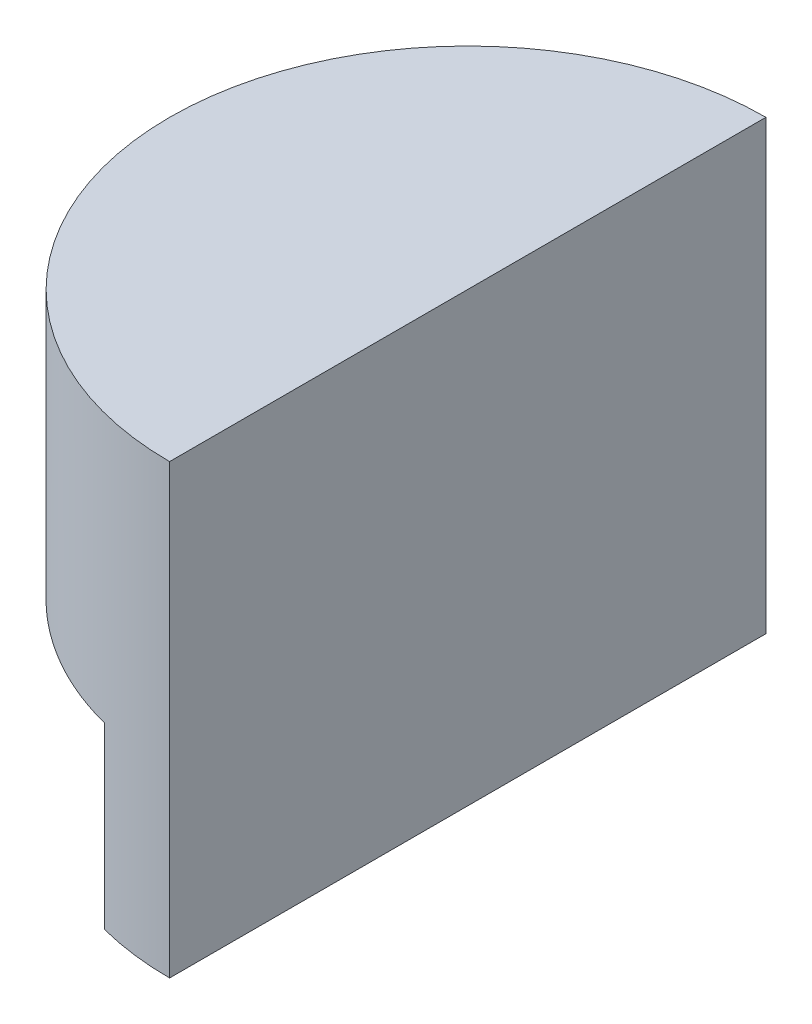
ISO-10303-21;
HEADER;
FILE_DESCRIPTION(('STEP AP214'),'2;1');
FILE_NAME('part.step','',(''),(''),'','','');
FILE_SCHEMA(('AUTOMOTIVE_DESIGN { 1 0 10303 214 1 1 1 1 }'));
ENDSEC;
DATA;
#1=APPLICATION_CONTEXT('core data for automotive mechanical design processes');
#2=APPLICATION_PROTOCOL_DEFINITION('international standard','automotive_design',2000,#1);
#3=PRODUCT_CONTEXT('',#1,'mechanical');
#4=PRODUCT('Part','Part','',(#3));
#5=PRODUCT_RELATED_PRODUCT_CATEGORY('part','',(#4));
#6=PRODUCT_DEFINITION_FORMATION('','',#4);
#7=PRODUCT_DEFINITION_CONTEXT('part definition',#1,'design');
#8=PRODUCT_DEFINITION('design','',#6,#7);
#9=PRODUCT_DEFINITION_SHAPE('','',#8);
#10=(LENGTH_UNIT() NAMED_UNIT(*) SI_UNIT(.MILLI.,.METRE.));
#11=(NAMED_UNIT(*) PLANE_ANGLE_UNIT() SI_UNIT($,.RADIAN.));
#12=(NAMED_UNIT(*) SI_UNIT($,.STERADIAN.) SOLID_ANGLE_UNIT());
#13=UNCERTAINTY_MEASURE_WITH_UNIT(LENGTH_MEASURE(1.E-05),#10,'distance_accuracy_value','');
#14=(GEOMETRIC_REPRESENTATION_CONTEXT(3) GLOBAL_UNCERTAINTY_ASSIGNED_CONTEXT((#13)) GLOBAL_UNIT_ASSIGNED_CONTEXT((#10,
#11,#12)) REPRESENTATION_CONTEXT('',''));
#15=CARTESIAN_POINT('',(0.,0.,0.));
#16=DIRECTION('',(0.,0.,1.));
#17=DIRECTION('',(1.,0.,0.));
#18=AXIS2_PLACEMENT_3D('',#15,#16,#17);
#19=CARTESIAN_POINT('',(0.,15.,0.));
#20=DIRECTION('',(0.,-1.,0.));
#21=DIRECTION('',(0.,0.,-1.));
#22=AXIS2_PLACEMENT_3D('',#19,#20,#21);
#23=CYLINDRICAL_SURFACE('',#22,10.);
#24=CARTESIAN_POINT('',(0.,6.,0.));
#25=DIRECTION('',(0.,1.,0.));
#26=DIRECTION('',(-1.,0.,0.));
#27=AXIS2_PLACEMENT_3D('',#24,#25,#26);
#28=CIRCLE('',#27,10.);
#29=CARTESIAN_POINT('',(-2.5,6.,-9.68245836551854));
#30=VERTEX_POINT('',#29);
#31=CARTESIAN_POINT('',(-10.,6.,0.));
#32=VERTEX_POINT('',#31);
#33=EDGE_CURVE('E11',#30,#32,#28,.T.);
#34=ORIENTED_EDGE('',*,*,#33,.T.);
#35=CARTESIAN_POINT('',(-2.5,6.,9.68245836551854));
#36=VERTEX_POINT('',#35);
#37=EDGE_CURVE('E51',#32,#36,#28,.T.);
#38=ORIENTED_EDGE('',*,*,#37,.T.);
#39=DIRECTION('',(0.,-1.,0.));
#40=VECTOR('',#39,1.);
#41=CARTESIAN_POINT('',(-2.5,15.,9.68245836551854));
#42=LINE('',#41,#40);
#43=CARTESIAN_POINT('',(-2.5,0.,9.68245836551854));
#44=VERTEX_POINT('',#43);
#45=EDGE_CURVE('E103',#36,#44,#42,.T.);
#46=ORIENTED_EDGE('',*,*,#45,.T.);
#47=CARTESIAN_POINT('',(0.,0.,0.));
#48=DIRECTION('',(0.,1.,0.));
#49=DIRECTION('',(0.,0.,1.));
#50=AXIS2_PLACEMENT_3D('',#47,#48,#49);
#51=CIRCLE('',#50,10.);
#52=CARTESIAN_POINT('',(0.,0.,10.));
#53=VERTEX_POINT('',#52);
#54=EDGE_CURVE('E100',#44,#53,#51,.T.);
#55=ORIENTED_EDGE('',*,*,#54,.T.);
#56=DIRECTION('',(0.,-1.,0.));
#57=VECTOR('',#56,1.);
#58=CARTESIAN_POINT('',(0.,15.,10.));
#59=LINE('',#58,#57);
#60=CARTESIAN_POINT('',(0.,15.,10.));
#61=VERTEX_POINT('',#60);
#62=EDGE_CURVE('E85',#61,#53,#59,.T.);
#63=ORIENTED_EDGE('',*,*,#62,.F.);
#64=CARTESIAN_POINT('',(0.,15.,0.));
#65=DIRECTION('',(0.,1.,0.));
#66=DIRECTION('',(0.,0.,1.));
#67=AXIS2_PLACEMENT_3D('',#64,#65,#66);
#68=CIRCLE('',#67,10.);
#69=CARTESIAN_POINT('',(0.,15.,-10.));
#70=VERTEX_POINT('',#69);
#71=EDGE_CURVE('E90',#70,#61,#68,.T.);
#72=ORIENTED_EDGE('',*,*,#71,.F.);
#73=DIRECTION('',(0.,-1.,0.));
#74=VECTOR('',#73,1.);
#75=CARTESIAN_POINT('',(0.,15.,-10.));
#76=LINE('',#75,#74);
#77=CARTESIAN_POINT('',(0.,0.,-10.));
#78=VERTEX_POINT('',#77);
#79=EDGE_CURVE('E82',#70,#78,#76,.T.);
#80=ORIENTED_EDGE('',*,*,#79,.T.);
#81=CARTESIAN_POINT('',(-2.5,0.,-9.68245836551854));
#82=VERTEX_POINT('',#81);
#83=EDGE_CURVE('E91',#78,#82,#51,.T.);
#84=ORIENTED_EDGE('',*,*,#83,.T.);
#85=DIRECTION('',(0.,-1.,0.));
#86=VECTOR('',#85,1.);
#87=CARTESIAN_POINT('',(-2.5,15.,-9.68245836551854));
#88=LINE('',#87,#86);
#89=EDGE_CURVE('E58',#82,#30,#88,.F.);
#90=ORIENTED_EDGE('',*,*,#89,.T.);
#91=EDGE_LOOP('',(#34,#38,#46,#55,#63,#72,#80,#84,#90));
#92=FACE_BOUND('',#91,.T.);
#93=ADVANCED_FACE('F43',(#92),#23,.T.);
#94=CARTESIAN_POINT('',(0.,15.,-10.));
#95=DIRECTION('',(-1.,0.,0.));
#96=DIRECTION('',(0.,0.,1.));
#97=AXIS2_PLACEMENT_3D('',#94,#95,#96);
#98=PLANE('',#97);
#99=DIRECTION('',(0.,0.,-1.));
#100=VECTOR('',#99,1.);
#101=CARTESIAN_POINT('',(0.,0.,-10.));
#102=LINE('',#101,#100);
#103=EDGE_CURVE('E79',#53,#78,#102,.T.);
#104=ORIENTED_EDGE('',*,*,#103,.T.);
#105=ORIENTED_EDGE('',*,*,#79,.F.);
#106=DIRECTION('',(0.,0.,-1.));
#107=VECTOR('',#106,1.);
#108=CARTESIAN_POINT('',(0.,15.,-10.));
#109=LINE('',#108,#107);
#110=EDGE_CURVE('E66',#61,#70,#109,.T.);
#111=ORIENTED_EDGE('',*,*,#110,.F.);
#112=ORIENTED_EDGE('',*,*,#62,.T.);
#113=EDGE_LOOP('',(#104,#105,#111,#112));
#114=FACE_BOUND('',#113,.T.);
#115=ADVANCED_FACE('F81',(#114),#98,.F.);
#116=CARTESIAN_POINT('',(0.,15.,0.));
#117=DIRECTION('',(0.,1.,0.));
#118=DIRECTION('',(0.,0.,1.));
#119=AXIS2_PLACEMENT_3D('',#116,#117,#118);
#120=PLANE('',#119);
#121=ORIENTED_EDGE('',*,*,#71,.T.);
#122=ORIENTED_EDGE('',*,*,#110,.T.);
#123=EDGE_LOOP('',(#121,#122));
#124=FACE_BOUND('',#123,.T.);
#125=ADVANCED_FACE('F138',(#124),#120,.T.);
#126=CARTESIAN_POINT('',(0.,0.,0.));
#127=DIRECTION('',(0.,1.,0.));
#128=DIRECTION('',(0.,0.,1.));
#129=AXIS2_PLACEMENT_3D('',#126,#127,#128);
#130=PLANE('',#129);
#131=ORIENTED_EDGE('',*,*,#54,.F.);
#132=DIRECTION('',(0.,0.,-1.));
#133=VECTOR('',#132,1.);
#134=CARTESIAN_POINT('',(-2.5,0.,0.));
#135=LINE('',#134,#133);
#136=EDGE_CURVE('E98',#44,#82,#135,.T.);
#137=ORIENTED_EDGE('',*,*,#136,.T.);
#138=ORIENTED_EDGE('',*,*,#83,.F.);
#139=ORIENTED_EDGE('',*,*,#103,.F.);
#140=EDGE_LOOP('',(#131,#137,#138,#139));
#141=FACE_BOUND('',#140,.T.);
#142=ADVANCED_FACE('F97',(#141),#130,.F.);
#143=CARTESIAN_POINT('',(-2.5,6.,-10.));
#144=DIRECTION('',(0.,1.,0.));
#145=DIRECTION('',(-1.,0.,0.));
#146=AXIS2_PLACEMENT_3D('',#143,#144,#145);
#147=PLANE('',#146);
#148=ORIENTED_EDGE('',*,*,#37,.F.);
#149=CARTESIAN_POINT('',(-7.5,6.,0.));
#150=DIRECTION('',(0.,-1.,0.));
#151=DIRECTION('',(1.,0.,0.));
#152=AXIS2_PLACEMENT_3D('',#149,#150,#151);
#153=CIRCLE('',#152,2.5);
#154=EDGE_CURVE('E133',#32,#32,#153,.T.);
#155=ORIENTED_EDGE('',*,*,#154,.F.);
#156=ORIENTED_EDGE('',*,*,#33,.F.);
#157=DIRECTION('',(0.,0.,1.));
#158=VECTOR('',#157,1.);
#159=CARTESIAN_POINT('',(-2.5,6.,-10.));
#160=LINE('',#159,#158);
#161=EDGE_CURVE('E122',#30,#36,#160,.T.);
#162=ORIENTED_EDGE('',*,*,#161,.T.);
#163=EDGE_LOOP('',(#148,#155,#156,#162));
#164=FACE_BOUND('',#163,.T.);
#165=ADVANCED_FACE('F125',(#164),#147,.F.);
#166=CARTESIAN_POINT('',(-2.5,0.,-10.));
#167=DIRECTION('',(1.,0.,0.));
#168=DIRECTION('',(0.,0.,-1.));
#169=AXIS2_PLACEMENT_3D('',#166,#167,#168);
#170=PLANE('',#169);
#171=ORIENTED_EDGE('',*,*,#161,.F.);
#172=ORIENTED_EDGE('',*,*,#89,.F.);
#173=ORIENTED_EDGE('',*,*,#136,.F.);
#174=ORIENTED_EDGE('',*,*,#45,.F.);
#175=EDGE_LOOP('',(#171,#172,#173,#174));
#176=FACE_BOUND('',#175,.T.);
#177=ADVANCED_FACE('F121',(#176),#170,.F.);
#178=CARTESIAN_POINT('',(-7.5,0.,0.));
#179=DIRECTION('',(0.,1.,0.));
#180=DIRECTION('',(-1.,0.,0.));
#181=AXIS2_PLACEMENT_3D('',#178,#179,#180);
#182=CYLINDRICAL_SURFACE('',#181,2.5);
#183=CARTESIAN_POINT('',(-7.5,0.,0.));
#184=DIRECTION('',(0.,-1.,0.));
#185=DIRECTION('',(1.,0.,0.));
#186=AXIS2_PLACEMENT_3D('',#183,#184,#185);
#187=CIRCLE('',#186,2.5);
#188=CARTESIAN_POINT('',(-5.,0.,0.));
#189=VERTEX_POINT('',#188);
#190=EDGE_CURVE('E127',#189,#189,#187,.T.);
#191=ORIENTED_EDGE('',*,*,#190,.F.);
#192=EDGE_LOOP('',(#191));
#193=FACE_BOUND('',#192,.T.);
#194=ORIENTED_EDGE('',*,*,#154,.T.);
#195=EDGE_LOOP('',(#194));
#196=FACE_BOUND('',#195,.T.);
#197=ADVANCED_FACE('F181',(#193,#196),#182,.T.);
#198=CARTESIAN_POINT('',(-7.5,0.,0.));
#199=DIRECTION('',(0.,-1.,0.));
#200=DIRECTION('',(1.,0.,0.));
#201=AXIS2_PLACEMENT_3D('',#198,#199,#200);
#202=PLANE('',#201);
#203=ORIENTED_EDGE('',*,*,#190,.T.);
#204=EDGE_LOOP('',(#203));
#205=FACE_BOUND('',#204,.T.);
#206=ADVANCED_FACE('F192',(#205),#202,.T.);
#207=CLOSED_SHELL('',(#93,#115,#125,#142,#165,#177,#197,#206));
#208=MANIFOLD_SOLID_BREP('B2',#207);
#209=ADVANCED_BREP_SHAPE_REPRESENTATION('',(#18,#208),#14);
#210=SHAPE_DEFINITION_REPRESENTATION(#9,#209);
ENDSEC;
END-ISO-10303-21;
